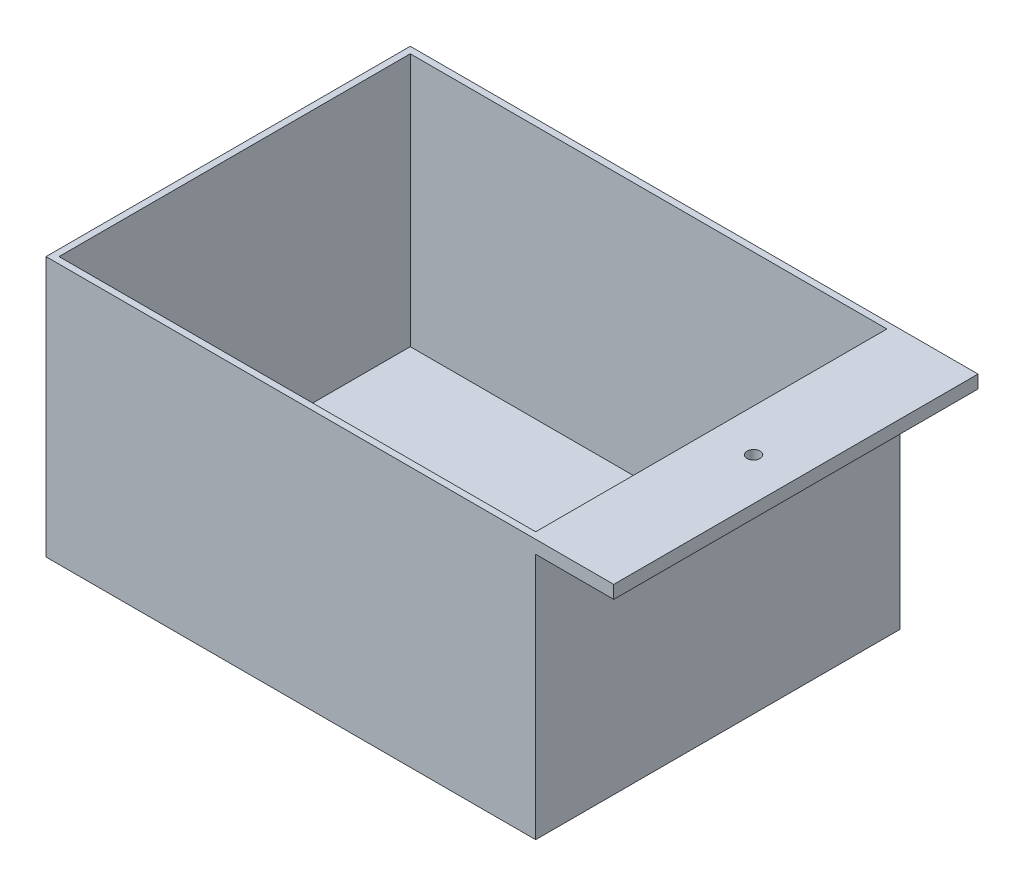
ISO-10303-21;
HEADER;
FILE_DESCRIPTION(('STEP AP214'),'2;1');
FILE_NAME('part.step','',(''),(''),'','','');
FILE_SCHEMA(('AUTOMOTIVE_DESIGN { 1 0 10303 214 1 1 1 1 }'));
ENDSEC;
DATA;
#1=APPLICATION_CONTEXT('core data for automotive mechanical design processes');
#2=APPLICATION_PROTOCOL_DEFINITION('international standard','automotive_design',2000,#1);
#3=PRODUCT_CONTEXT('',#1,'mechanical');
#4=PRODUCT('Part','Part','',(#3));
#5=PRODUCT_RELATED_PRODUCT_CATEGORY('part','',(#4));
#6=PRODUCT_DEFINITION_FORMATION('','',#4);
#7=PRODUCT_DEFINITION_CONTEXT('part definition',#1,'design');
#8=PRODUCT_DEFINITION('design','',#6,#7);
#9=PRODUCT_DEFINITION_SHAPE('','',#8);
#10=(LENGTH_UNIT() NAMED_UNIT(*) SI_UNIT(.MILLI.,.METRE.));
#11=(NAMED_UNIT(*) PLANE_ANGLE_UNIT() SI_UNIT($,.RADIAN.));
#12=(NAMED_UNIT(*) SI_UNIT($,.STERADIAN.) SOLID_ANGLE_UNIT());
#13=UNCERTAINTY_MEASURE_WITH_UNIT(LENGTH_MEASURE(1.E-05),#10,'distance_accuracy_value','');
#14=(GEOMETRIC_REPRESENTATION_CONTEXT(3) GLOBAL_UNCERTAINTY_ASSIGNED_CONTEXT((#13)) GLOBAL_UNIT_ASSIGNED_CONTEXT((#10,
#11,#12)) REPRESENTATION_CONTEXT('',''));
#15=CARTESIAN_POINT('',(0.,0.,0.));
#16=DIRECTION('',(0.,0.,1.));
#17=DIRECTION('',(1.,0.,0.));
#18=AXIS2_PLACEMENT_3D('',#15,#16,#17);
#19=CARTESIAN_POINT('',(119.507,127.,-88.9));
#20=DIRECTION('',(-1.,0.,0.));
#21=DIRECTION('',(0.,0.,1.));
#22=AXIS2_PLACEMENT_3D('',#19,#20,#21);
#23=PLANE('',#22);
#24=DIRECTION('',(0.,0.,-1.));
#25=VECTOR('',#24,1.);
#26=CARTESIAN_POINT('',(119.507,120.65,88.9));
#27=LINE('',#26,#25);
#28=CARTESIAN_POINT('',(119.507,120.65,88.9));
#29=VERTEX_POINT('',#28);
#30=CARTESIAN_POINT('',(119.507,120.65,-88.9));
#31=VERTEX_POINT('',#30);
#32=EDGE_CURVE('E54',#29,#31,#27,.T.);
#33=ORIENTED_EDGE('',*,*,#32,.F.);
#34=DIRECTION('',(0.,-1.,0.));
#35=VECTOR('',#34,1.);
#36=CARTESIAN_POINT('',(119.507,127.,88.9));
#37=LINE('',#36,#35);
#38=CARTESIAN_POINT('',(119.507,0.,88.9));
#39=VERTEX_POINT('',#38);
#40=EDGE_CURVE('E140',#29,#39,#37,.T.);
#41=ORIENTED_EDGE('',*,*,#40,.T.);
#42=DIRECTION('',(0.,0.,-1.));
#43=VECTOR('',#42,1.);
#44=CARTESIAN_POINT('',(119.507,0.,-88.9));
#45=LINE('',#44,#43);
#46=CARTESIAN_POINT('',(119.507,0.,-88.9));
#47=VERTEX_POINT('',#46);
#48=EDGE_CURVE('E181',#39,#47,#45,.T.);
#49=ORIENTED_EDGE('',*,*,#48,.T.);
#50=DIRECTION('',(0.,-1.,0.));
#51=VECTOR('',#50,1.);
#52=CARTESIAN_POINT('',(119.507,127.,-88.9));
#53=LINE('',#52,#51);
#54=EDGE_CURVE('E11',#31,#47,#53,.T.);
#55=ORIENTED_EDGE('',*,*,#54,.F.);
#56=EDGE_LOOP('',(#33,#41,#49,#55));
#57=FACE_BOUND('',#56,.T.);
#58=ADVANCED_FACE('F39',(#57),#23,.F.);
#59=CARTESIAN_POINT('',(-119.507,127.,-88.9));
#60=DIRECTION('',(0.,0.,1.));
#61=DIRECTION('',(1.,0.,0.));
#62=AXIS2_PLACEMENT_3D('',#59,#60,#61);
#63=PLANE('',#62);
#64=DIRECTION('',(-1.,0.,0.));
#65=VECTOR('',#64,1.);
#66=CARTESIAN_POINT('',(-119.507,0.,-88.9));
#67=LINE('',#66,#65);
#68=CARTESIAN_POINT('',(-119.507,0.,-88.9));
#69=VERTEX_POINT('',#68);
#70=EDGE_CURVE('E203',#47,#69,#67,.T.);
#71=ORIENTED_EDGE('',*,*,#70,.T.);
#72=DIRECTION('',(0.,-1.,0.));
#73=VECTOR('',#72,1.);
#74=CARTESIAN_POINT('',(-119.507,127.,-88.9));
#75=LINE('',#74,#73);
#76=CARTESIAN_POINT('',(-119.507,127.,-88.9));
#77=VERTEX_POINT('',#76);
#78=EDGE_CURVE('E47',#77,#69,#75,.T.);
#79=ORIENTED_EDGE('',*,*,#78,.F.);
#80=DIRECTION('',(-1.,0.,0.));
#81=VECTOR('',#80,1.);
#82=CARTESIAN_POINT('',(-119.507,127.,-88.9));
#83=LINE('',#82,#81);
#84=CARTESIAN_POINT('',(157.607,127.,-88.9));
#85=VERTEX_POINT('',#84);
#86=EDGE_CURVE('E190',#85,#77,#83,.T.);
#87=ORIENTED_EDGE('',*,*,#86,.F.);
#88=DIRECTION('',(0.,1.,0.));
#89=VECTOR('',#88,1.);
#90=CARTESIAN_POINT('',(157.607,127.,-88.9));
#91=LINE('',#90,#89);
#92=CARTESIAN_POINT('',(157.607,120.65,-88.9));
#93=VERTEX_POINT('',#92);
#94=EDGE_CURVE('E126',#93,#85,#91,.T.);
#95=ORIENTED_EDGE('',*,*,#94,.F.);
#96=DIRECTION('',(-1.,0.,0.));
#97=VECTOR('',#96,1.);
#98=CARTESIAN_POINT('',(157.607,120.65,-88.9));
#99=LINE('',#98,#97);
#100=EDGE_CURVE('E121',#93,#31,#99,.T.);
#101=ORIENTED_EDGE('',*,*,#100,.T.);
#102=ORIENTED_EDGE('',*,*,#54,.T.);
#103=EDGE_LOOP('',(#71,#79,#87,#95,#101,#102));
#104=FACE_BOUND('',#103,.T.);
#105=ADVANCED_FACE('F232',(#104),#63,.F.);
#106=CARTESIAN_POINT('',(-119.507,127.,-88.9));
#107=DIRECTION('',(1.,0.,0.));
#108=DIRECTION('',(0.,0.,-1.));
#109=AXIS2_PLACEMENT_3D('',#106,#107,#108);
#110=PLANE('',#109);
#111=DIRECTION('',(0.,0.,1.));
#112=VECTOR('',#111,1.);
#113=CARTESIAN_POINT('',(-119.507,0.,-88.9));
#114=LINE('',#113,#112);
#115=CARTESIAN_POINT('',(-119.507,0.,88.9));
#116=VERTEX_POINT('',#115);
#117=EDGE_CURVE('E206',#69,#116,#114,.T.);
#118=ORIENTED_EDGE('',*,*,#117,.T.);
#119=DIRECTION('',(0.,-1.,0.));
#120=VECTOR('',#119,1.);
#121=CARTESIAN_POINT('',(-119.507,127.,88.9));
#122=LINE('',#121,#120);
#123=CARTESIAN_POINT('',(-119.507,127.,88.9));
#124=VERTEX_POINT('',#123);
#125=EDGE_CURVE('E213',#124,#116,#122,.T.);
#126=ORIENTED_EDGE('',*,*,#125,.F.);
#127=DIRECTION('',(0.,0.,1.));
#128=VECTOR('',#127,1.);
#129=CARTESIAN_POINT('',(-119.507,127.,-88.9));
#130=LINE('',#129,#128);
#131=EDGE_CURVE('E193',#77,#124,#130,.T.);
#132=ORIENTED_EDGE('',*,*,#131,.F.);
#133=ORIENTED_EDGE('',*,*,#78,.T.);
#134=EDGE_LOOP('',(#118,#126,#132,#133));
#135=FACE_BOUND('',#134,.T.);
#136=ADVANCED_FACE('F222',(#135),#110,.F.);
#137=CARTESIAN_POINT('',(-119.507,127.,88.9));
#138=DIRECTION('',(0.,0.,-1.));
#139=DIRECTION('',(-1.,0.,0.));
#140=AXIS2_PLACEMENT_3D('',#137,#138,#139);
#141=PLANE('',#140);
#142=DIRECTION('',(1.,0.,0.));
#143=VECTOR('',#142,1.);
#144=CARTESIAN_POINT('',(-119.507,0.,88.9));
#145=LINE('',#144,#143);
#146=EDGE_CURVE('E194',#116,#39,#145,.T.);
#147=ORIENTED_EDGE('',*,*,#146,.T.);
#148=ORIENTED_EDGE('',*,*,#40,.F.);
#149=DIRECTION('',(-1.,0.,0.));
#150=VECTOR('',#149,1.);
#151=CARTESIAN_POINT('',(157.607,120.65,88.9));
#152=LINE('',#151,#150);
#153=CARTESIAN_POINT('',(157.607,120.65,88.9));
#154=VERTEX_POINT('',#153);
#155=EDGE_CURVE('E119',#154,#29,#152,.T.);
#156=ORIENTED_EDGE('',*,*,#155,.F.);
#157=DIRECTION('',(0.,-1.,0.));
#158=VECTOR('',#157,1.);
#159=CARTESIAN_POINT('',(157.607,127.,88.9));
#160=LINE('',#159,#158);
#161=CARTESIAN_POINT('',(157.607,127.,88.9));
#162=VERTEX_POINT('',#161);
#163=EDGE_CURVE('E127',#162,#154,#160,.T.);
#164=ORIENTED_EDGE('',*,*,#163,.F.);
#165=DIRECTION('',(1.,0.,0.));
#166=VECTOR('',#165,1.);
#167=CARTESIAN_POINT('',(-119.507,127.,88.9));
#168=LINE('',#167,#166);
#169=EDGE_CURVE('E197',#124,#162,#168,.T.);
#170=ORIENTED_EDGE('',*,*,#169,.F.);
#171=ORIENTED_EDGE('',*,*,#125,.T.);
#172=EDGE_LOOP('',(#147,#148,#156,#164,#170,#171));
#173=FACE_BOUND('',#172,.T.);
#174=ADVANCED_FACE('F139',(#173),#141,.F.);
#175=CARTESIAN_POINT('',(0.,127.,0.));
#176=DIRECTION('',(0.,1.,0.));
#177=DIRECTION('',(0.,0.,1.));
#178=AXIS2_PLACEMENT_3D('',#175,#176,#177);
#179=PLANE('',#178);
#180=CARTESIAN_POINT('',(136.9695,127.,0.));
#181=DIRECTION('',(0.,1.,0.));
#182=DIRECTION('',(0.,0.,1.));
#183=AXIS2_PLACEMENT_3D('',#180,#181,#182);
#184=CIRCLE('',#183,3.175);
#185=CARTESIAN_POINT('',(136.9695,127.,3.17499999999999));
#186=VERTEX_POINT('',#185);
#187=EDGE_CURVE('E241',#186,#186,#184,.T.);
#188=ORIENTED_EDGE('',*,*,#187,.F.);
#189=EDGE_LOOP('',(#188));
#190=FACE_BOUND('',#189,.T.);
#191=DIRECTION('',(0.,0.,-1.));
#192=VECTOR('',#191,1.);
#193=CARTESIAN_POINT('',(116.332,127.,-85.725));
#194=LINE('',#193,#192);
#195=CARTESIAN_POINT('',(116.332,127.,85.725));
#196=VERTEX_POINT('',#195);
#197=CARTESIAN_POINT('',(116.332,127.,-85.725));
#198=VERTEX_POINT('',#197);
#199=EDGE_CURVE('E62',#196,#198,#194,.T.);
#200=ORIENTED_EDGE('',*,*,#199,.F.);
#201=DIRECTION('',(1.,0.,0.));
#202=VECTOR('',#201,1.);
#203=CARTESIAN_POINT('',(-116.332,127.,85.725));
#204=LINE('',#203,#202);
#205=CARTESIAN_POINT('',(-116.332,127.,85.725));
#206=VERTEX_POINT('',#205);
#207=EDGE_CURVE('E155',#206,#196,#204,.T.);
#208=ORIENTED_EDGE('',*,*,#207,.F.);
#209=DIRECTION('',(0.,0.,1.));
#210=VECTOR('',#209,1.);
#211=CARTESIAN_POINT('',(-116.332,127.,-85.725));
#212=LINE('',#211,#210);
#213=CARTESIAN_POINT('',(-116.332,127.,-85.725));
#214=VERTEX_POINT('',#213);
#215=EDGE_CURVE('E171',#214,#206,#212,.T.);
#216=ORIENTED_EDGE('',*,*,#215,.F.);
#217=DIRECTION('',(-1.,0.,0.));
#218=VECTOR('',#217,1.);
#219=CARTESIAN_POINT('',(-116.332,127.,-85.725));
#220=LINE('',#219,#218);
#221=EDGE_CURVE('E145',#198,#214,#220,.T.);
#222=ORIENTED_EDGE('',*,*,#221,.F.);
#223=EDGE_LOOP('',(#200,#208,#216,#222));
#224=FACE_BOUND('',#223,.T.);
#225=ORIENTED_EDGE('',*,*,#169,.T.);
#226=DIRECTION('',(0.,0.,1.));
#227=VECTOR('',#226,1.);
#228=CARTESIAN_POINT('',(157.607,127.,88.9));
#229=LINE('',#228,#227);
#230=EDGE_CURVE('E133',#85,#162,#229,.T.);
#231=ORIENTED_EDGE('',*,*,#230,.F.);
#232=ORIENTED_EDGE('',*,*,#86,.T.);
#233=ORIENTED_EDGE('',*,*,#131,.T.);
#234=EDGE_LOOP('',(#225,#231,#232,#233));
#235=FACE_BOUND('',#234,.T.);
#236=ADVANCED_FACE('F231',(#190,#224,#235),#179,.T.);
#237=CARTESIAN_POINT('',(0.,0.,0.));
#238=DIRECTION('',(0.,1.,0.));
#239=DIRECTION('',(0.,0.,1.));
#240=AXIS2_PLACEMENT_3D('',#237,#238,#239);
#241=PLANE('',#240);
#242=ORIENTED_EDGE('',*,*,#48,.F.);
#243=ORIENTED_EDGE('',*,*,#146,.F.);
#244=ORIENTED_EDGE('',*,*,#117,.F.);
#245=ORIENTED_EDGE('',*,*,#70,.F.);
#246=EDGE_LOOP('',(#242,#243,#244,#245));
#247=FACE_BOUND('',#246,.T.);
#248=ADVANCED_FACE('F229',(#247),#241,.F.);
#249=CARTESIAN_POINT('',(116.332,3.17500000000001,-85.725));
#250=DIRECTION('',(1.,0.,0.));
#251=DIRECTION('',(0.,0.,-1.));
#252=AXIS2_PLACEMENT_3D('',#249,#250,#251);
#253=PLANE('',#252);
#254=ORIENTED_EDGE('',*,*,#199,.T.);
#255=DIRECTION('',(0.,1.,0.));
#256=VECTOR('',#255,1.);
#257=CARTESIAN_POINT('',(116.332,3.17500000000001,-85.725));
#258=LINE('',#257,#256);
#259=CARTESIAN_POINT('',(116.332,3.17500000000001,-85.725));
#260=VERTEX_POINT('',#259);
#261=EDGE_CURVE('E166',#260,#198,#258,.T.);
#262=ORIENTED_EDGE('',*,*,#261,.F.);
#263=DIRECTION('',(0.,0.,-1.));
#264=VECTOR('',#263,1.);
#265=CARTESIAN_POINT('',(116.332,3.17500000000001,-85.725));
#266=LINE('',#265,#264);
#267=CARTESIAN_POINT('',(116.332,3.17500000000001,85.725));
#268=VERTEX_POINT('',#267);
#269=EDGE_CURVE('E150',#268,#260,#266,.T.);
#270=ORIENTED_EDGE('',*,*,#269,.F.);
#271=DIRECTION('',(0.,1.,0.));
#272=VECTOR('',#271,1.);
#273=CARTESIAN_POINT('',(116.332,3.17500000000001,85.725));
#274=LINE('',#273,#272);
#275=EDGE_CURVE('E178',#268,#196,#274,.T.);
#276=ORIENTED_EDGE('',*,*,#275,.T.);
#277=EDGE_LOOP('',(#254,#262,#270,#276));
#278=FACE_BOUND('',#277,.T.);
#279=ADVANCED_FACE('F263',(#278),#253,.F.);
#280=CARTESIAN_POINT('',(-116.332,3.17500000000001,85.725));
#281=DIRECTION('',(0.,0.,1.));
#282=DIRECTION('',(1.,0.,0.));
#283=AXIS2_PLACEMENT_3D('',#280,#281,#282);
#284=PLANE('',#283);
#285=ORIENTED_EDGE('',*,*,#207,.T.);
#286=ORIENTED_EDGE('',*,*,#275,.F.);
#287=DIRECTION('',(1.,0.,0.));
#288=VECTOR('',#287,1.);
#289=CARTESIAN_POINT('',(-116.332,3.17500000000001,85.725));
#290=LINE('',#289,#288);
#291=CARTESIAN_POINT('',(-116.332,3.17500000000001,85.725));
#292=VERTEX_POINT('',#291);
#293=EDGE_CURVE('E163',#292,#268,#290,.T.);
#294=ORIENTED_EDGE('',*,*,#293,.F.);
#295=DIRECTION('',(0.,1.,0.));
#296=VECTOR('',#295,1.);
#297=CARTESIAN_POINT('',(-116.332,3.17500000000001,85.725));
#298=LINE('',#297,#296);
#299=EDGE_CURVE('E182',#292,#206,#298,.T.);
#300=ORIENTED_EDGE('',*,*,#299,.T.);
#301=EDGE_LOOP('',(#285,#286,#294,#300));
#302=FACE_BOUND('',#301,.T.);
#303=ADVANCED_FACE('F268',(#302),#284,.F.);
#304=CARTESIAN_POINT('',(-116.332,3.17500000000001,-85.725));
#305=DIRECTION('',(-1.,0.,0.));
#306=DIRECTION('',(0.,0.,1.));
#307=AXIS2_PLACEMENT_3D('',#304,#305,#306);
#308=PLANE('',#307);
#309=ORIENTED_EDGE('',*,*,#215,.T.);
#310=ORIENTED_EDGE('',*,*,#299,.F.);
#311=DIRECTION('',(0.,0.,1.));
#312=VECTOR('',#311,1.);
#313=CARTESIAN_POINT('',(-116.332,3.17500000000001,-85.725));
#314=LINE('',#313,#312);
#315=CARTESIAN_POINT('',(-116.332,3.17500000000001,-85.725));
#316=VERTEX_POINT('',#315);
#317=EDGE_CURVE('E159',#316,#292,#314,.T.);
#318=ORIENTED_EDGE('',*,*,#317,.F.);
#319=DIRECTION('',(0.,1.,0.));
#320=VECTOR('',#319,1.);
#321=CARTESIAN_POINT('',(-116.332,3.17500000000001,-85.725));
#322=LINE('',#321,#320);
#323=EDGE_CURVE('E185',#316,#214,#322,.T.);
#324=ORIENTED_EDGE('',*,*,#323,.T.);
#325=EDGE_LOOP('',(#309,#310,#318,#324));
#326=FACE_BOUND('',#325,.T.);
#327=ADVANCED_FACE('F270',(#326),#308,.F.);
#328=CARTESIAN_POINT('',(-116.332,3.17500000000001,-85.725));
#329=DIRECTION('',(0.,0.,-1.));
#330=DIRECTION('',(-1.,0.,0.));
#331=AXIS2_PLACEMENT_3D('',#328,#329,#330);
#332=PLANE('',#331);
#333=ORIENTED_EDGE('',*,*,#221,.T.);
#334=ORIENTED_EDGE('',*,*,#323,.F.);
#335=DIRECTION('',(-1.,0.,0.));
#336=VECTOR('',#335,1.);
#337=CARTESIAN_POINT('',(-116.332,3.17500000000001,-85.725));
#338=LINE('',#337,#336);
#339=EDGE_CURVE('E154',#260,#316,#338,.T.);
#340=ORIENTED_EDGE('',*,*,#339,.F.);
#341=ORIENTED_EDGE('',*,*,#261,.T.);
#342=EDGE_LOOP('',(#333,#334,#340,#341));
#343=FACE_BOUND('',#342,.T.);
#344=ADVANCED_FACE('F259',(#343),#332,.F.);
#345=CARTESIAN_POINT('',(0.,3.17500000000001,0.));
#346=DIRECTION('',(0.,1.,0.));
#347=DIRECTION('',(0.,0.,1.));
#348=AXIS2_PLACEMENT_3D('',#345,#346,#347);
#349=PLANE('',#348);
#350=ORIENTED_EDGE('',*,*,#269,.T.);
#351=ORIENTED_EDGE('',*,*,#339,.T.);
#352=ORIENTED_EDGE('',*,*,#317,.T.);
#353=ORIENTED_EDGE('',*,*,#293,.T.);
#354=EDGE_LOOP('',(#350,#351,#352,#353));
#355=FACE_BOUND('',#354,.T.);
#356=ADVANCED_FACE('F266',(#355),#349,.T.);
#357=CARTESIAN_POINT('',(157.607,120.65,88.9));
#358=DIRECTION('',(0.,1.,0.));
#359=DIRECTION('',(0.,0.,1.));
#360=AXIS2_PLACEMENT_3D('',#357,#358,#359);
#361=PLANE('',#360);
#362=CARTESIAN_POINT('',(136.9695,120.65,0.));
#363=DIRECTION('',(0.,1.,0.));
#364=DIRECTION('',(0.,0.,1.));
#365=AXIS2_PLACEMENT_3D('',#362,#363,#364);
#366=CIRCLE('',#365,3.175);
#367=CARTESIAN_POINT('',(136.9695,120.65,3.17499999999999));
#368=VERTEX_POINT('',#367);
#369=EDGE_CURVE('E238',#368,#368,#366,.F.);
#370=ORIENTED_EDGE('',*,*,#369,.F.);
#371=EDGE_LOOP('',(#370));
#372=FACE_BOUND('',#371,.T.);
#373=ORIENTED_EDGE('',*,*,#32,.T.);
#374=ORIENTED_EDGE('',*,*,#100,.F.);
#375=DIRECTION('',(0.,0.,-1.));
#376=VECTOR('',#375,1.);
#377=CARTESIAN_POINT('',(157.607,120.65,88.9));
#378=LINE('',#377,#376);
#379=EDGE_CURVE('E115',#154,#93,#378,.T.);
#380=ORIENTED_EDGE('',*,*,#379,.F.);
#381=ORIENTED_EDGE('',*,*,#155,.T.);
#382=EDGE_LOOP('',(#373,#374,#380,#381));
#383=FACE_BOUND('',#382,.T.);
#384=ADVANCED_FACE('F117',(#372,#383),#361,.F.);
#385=CARTESIAN_POINT('',(157.607,0.,0.));
#386=DIRECTION('',(1.,0.,0.));
#387=DIRECTION('',(0.,0.,-1.));
#388=AXIS2_PLACEMENT_3D('',#385,#386,#387);
#389=PLANE('',#388);
#390=ORIENTED_EDGE('',*,*,#163,.T.);
#391=ORIENTED_EDGE('',*,*,#379,.T.);
#392=ORIENTED_EDGE('',*,*,#94,.T.);
#393=ORIENTED_EDGE('',*,*,#230,.T.);
#394=EDGE_LOOP('',(#390,#391,#392,#393));
#395=FACE_BOUND('',#394,.T.);
#396=ADVANCED_FACE('F131',(#395),#389,.T.);
#397=CARTESIAN_POINT('',(136.9695,111.669743878931,0.));
#398=DIRECTION('',(0.,1.,0.));
#399=DIRECTION('',(0.,0.,1.));
#400=AXIS2_PLACEMENT_3D('',#397,#398,#399);
#401=CYLINDRICAL_SURFACE('',#400,3.175);
#402=ORIENTED_EDGE('',*,*,#369,.T.);
#403=EDGE_LOOP('',(#402));
#404=FACE_BOUND('',#403,.T.);
#405=ORIENTED_EDGE('',*,*,#187,.T.);
#406=EDGE_LOOP('',(#405));
#407=FACE_BOUND('',#406,.T.);
#408=ADVANCED_FACE('F250',(#404,#407),#401,.F.);
#409=CLOSED_SHELL('',(#58,#105,#136,#174,#236,#248,#279,#303,#327,#344,#356,#384,#396,#408));
#410=MANIFOLD_SOLID_BREP('B2',#409);
#411=ADVANCED_BREP_SHAPE_REPRESENTATION('',(#18,#410),#14);
#412=SHAPE_DEFINITION_REPRESENTATION(#9,#411);
ENDSEC;
END-ISO-10303-21;
